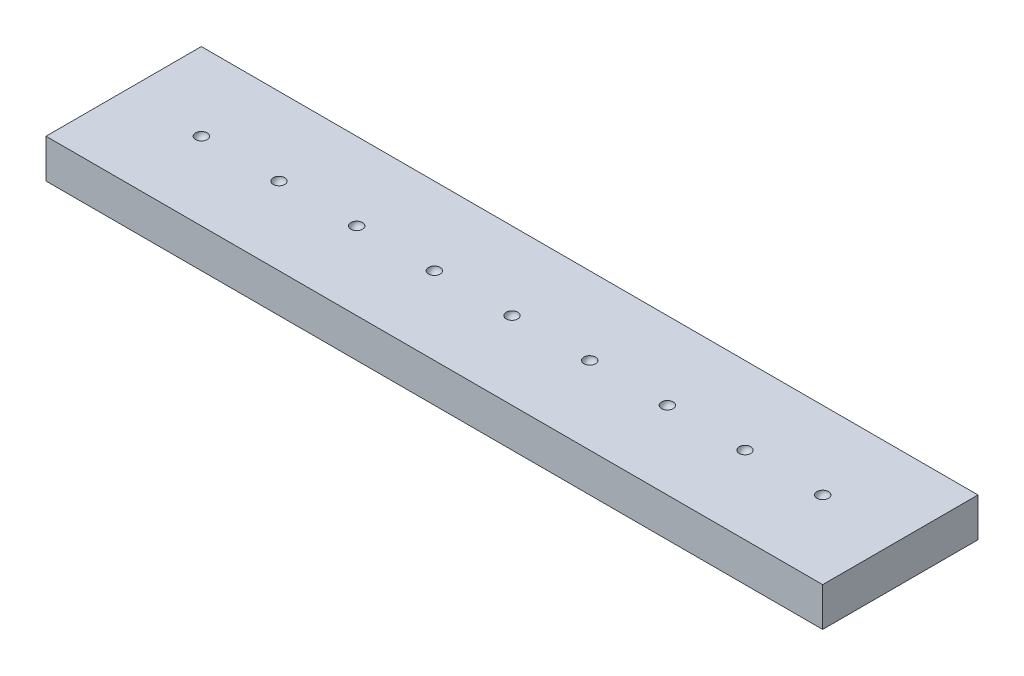
ISO-10303-21;
HEADER;
FILE_DESCRIPTION(('STEP AP214'),'2;1');
FILE_NAME('part.step','',(''),(''),'','','');
FILE_SCHEMA(('AUTOMOTIVE_DESIGN { 1 0 10303 214 1 1 1 1 }'));
ENDSEC;
DATA;
#1=APPLICATION_CONTEXT('core data for automotive mechanical design processes');
#2=APPLICATION_PROTOCOL_DEFINITION('international standard','automotive_design',2000,#1);
#3=PRODUCT_CONTEXT('',#1,'mechanical');
#4=PRODUCT('Part','Part','',(#3));
#5=PRODUCT_RELATED_PRODUCT_CATEGORY('part','',(#4));
#6=PRODUCT_DEFINITION_FORMATION('','',#4);
#7=PRODUCT_DEFINITION_CONTEXT('part definition',#1,'design');
#8=PRODUCT_DEFINITION('design','',#6,#7);
#9=PRODUCT_DEFINITION_SHAPE('','',#8);
#10=(LENGTH_UNIT() NAMED_UNIT(*) SI_UNIT(.MILLI.,.METRE.));
#11=(NAMED_UNIT(*) PLANE_ANGLE_UNIT() SI_UNIT($,.RADIAN.));
#12=(NAMED_UNIT(*) SI_UNIT($,.STERADIAN.) SOLID_ANGLE_UNIT());
#13=UNCERTAINTY_MEASURE_WITH_UNIT(LENGTH_MEASURE(1.E-05),#10,'distance_accuracy_value','');
#14=(GEOMETRIC_REPRESENTATION_CONTEXT(3) GLOBAL_UNCERTAINTY_ASSIGNED_CONTEXT((#13)) GLOBAL_UNIT_ASSIGNED_CONTEXT((#10,
#11,#12)) REPRESENTATION_CONTEXT('',''));
#15=CARTESIAN_POINT('',(0.,0.,0.));
#16=DIRECTION('',(0.,0.,1.));
#17=DIRECTION('',(1.,0.,0.));
#18=AXIS2_PLACEMENT_3D('',#15,#16,#17);
#19=CARTESIAN_POINT('',(0.,5.,0.));
#20=DIRECTION('',(1.,0.,0.));
#21=DIRECTION('',(0.,0.,-1.));
#22=AXIS2_PLACEMENT_3D('',#19,#20,#21);
#23=PLANE('',#22);
#24=DIRECTION('',(0.,0.,1.));
#25=VECTOR('',#24,1.);
#26=CARTESIAN_POINT('',(0.,0.,0.));
#27=LINE('',#26,#25);
#28=CARTESIAN_POINT('',(0.,0.,-20.));
#29=VERTEX_POINT('',#28);
#30=CARTESIAN_POINT('',(0.,0.,0.));
#31=VERTEX_POINT('',#30);
#32=EDGE_CURVE('E116',#29,#31,#27,.T.);
#33=ORIENTED_EDGE('',*,*,#32,.T.);
#34=DIRECTION('',(0.,-1.,0.));
#35=VECTOR('',#34,1.);
#36=CARTESIAN_POINT('',(0.,5.,0.));
#37=LINE('',#36,#35);
#38=CARTESIAN_POINT('',(0.,5.,0.));
#39=VERTEX_POINT('',#38);
#40=EDGE_CURVE('E11',#39,#31,#37,.T.);
#41=ORIENTED_EDGE('',*,*,#40,.F.);
#42=DIRECTION('',(0.,0.,1.));
#43=VECTOR('',#42,1.);
#44=CARTESIAN_POINT('',(0.,5.,0.));
#45=LINE('',#44,#43);
#46=CARTESIAN_POINT('',(0.,5.,-20.));
#47=VERTEX_POINT('',#46);
#48=EDGE_CURVE('E97',#47,#39,#45,.T.);
#49=ORIENTED_EDGE('',*,*,#48,.F.);
#50=DIRECTION('',(0.,-1.,0.));
#51=VECTOR('',#50,1.);
#52=CARTESIAN_POINT('',(0.,5.,-20.));
#53=LINE('',#52,#51);
#54=EDGE_CURVE('E115',#47,#29,#53,.T.);
#55=ORIENTED_EDGE('',*,*,#54,.T.);
#56=EDGE_LOOP('',(#33,#41,#49,#55));
#57=FACE_BOUND('',#56,.T.);
#58=ADVANCED_FACE('F44',(#57),#23,.F.);
#59=CARTESIAN_POINT('',(0.,5.,0.));
#60=DIRECTION('',(0.,0.,-1.));
#61=DIRECTION('',(-1.,0.,0.));
#62=AXIS2_PLACEMENT_3D('',#59,#60,#61);
#63=PLANE('',#62);
#64=DIRECTION('',(1.,0.,0.));
#65=VECTOR('',#64,1.);
#66=CARTESIAN_POINT('',(0.,0.,0.));
#67=LINE('',#66,#65);
#68=CARTESIAN_POINT('',(100.,0.,0.));
#69=VERTEX_POINT('',#68);
#70=EDGE_CURVE('E102',#31,#69,#67,.T.);
#71=ORIENTED_EDGE('',*,*,#70,.T.);
#72=DIRECTION('',(0.,-1.,0.));
#73=VECTOR('',#72,1.);
#74=CARTESIAN_POINT('',(100.,5.,0.));
#75=LINE('',#74,#73);
#76=CARTESIAN_POINT('',(100.,5.,0.));
#77=VERTEX_POINT('',#76);
#78=EDGE_CURVE('E54',#77,#69,#75,.T.);
#79=ORIENTED_EDGE('',*,*,#78,.F.);
#80=DIRECTION('',(1.,0.,0.));
#81=VECTOR('',#80,1.);
#82=CARTESIAN_POINT('',(0.,5.,0.));
#83=LINE('',#82,#81);
#84=EDGE_CURVE('E94',#39,#77,#83,.T.);
#85=ORIENTED_EDGE('',*,*,#84,.F.);
#86=ORIENTED_EDGE('',*,*,#40,.T.);
#87=EDGE_LOOP('',(#71,#79,#85,#86));
#88=FACE_BOUND('',#87,.T.);
#89=ADVANCED_FACE('F103',(#88),#63,.F.);
#90=CARTESIAN_POINT('',(100.,5.,0.));
#91=DIRECTION('',(-1.,0.,0.));
#92=DIRECTION('',(0.,0.,1.));
#93=AXIS2_PLACEMENT_3D('',#90,#91,#92);
#94=PLANE('',#93);
#95=DIRECTION('',(0.,0.,-1.));
#96=VECTOR('',#95,1.);
#97=CARTESIAN_POINT('',(100.,0.,0.));
#98=LINE('',#97,#96);
#99=CARTESIAN_POINT('',(100.,0.,-20.));
#100=VERTEX_POINT('',#99);
#101=EDGE_CURVE('E82',#69,#100,#98,.T.);
#102=ORIENTED_EDGE('',*,*,#101,.T.);
#103=DIRECTION('',(0.,-1.,0.));
#104=VECTOR('',#103,1.);
#105=CARTESIAN_POINT('',(100.,5.,-20.));
#106=LINE('',#105,#104);
#107=CARTESIAN_POINT('',(100.,5.,-20.));
#108=VERTEX_POINT('',#107);
#109=EDGE_CURVE('E106',#108,#100,#106,.T.);
#110=ORIENTED_EDGE('',*,*,#109,.F.);
#111=DIRECTION('',(0.,0.,-1.));
#112=VECTOR('',#111,1.);
#113=CARTESIAN_POINT('',(100.,5.,0.));
#114=LINE('',#113,#112);
#115=EDGE_CURVE('E100',#77,#108,#114,.T.);
#116=ORIENTED_EDGE('',*,*,#115,.F.);
#117=ORIENTED_EDGE('',*,*,#78,.T.);
#118=EDGE_LOOP('',(#102,#110,#116,#117));
#119=FACE_BOUND('',#118,.T.);
#120=ADVANCED_FACE('F107',(#119),#94,.F.);
#121=CARTESIAN_POINT('',(0.,5.,-20.));
#122=DIRECTION('',(0.,0.,1.));
#123=DIRECTION('',(1.,0.,0.));
#124=AXIS2_PLACEMENT_3D('',#121,#122,#123);
#125=PLANE('',#124);
#126=DIRECTION('',(-1.,0.,0.));
#127=VECTOR('',#126,1.);
#128=CARTESIAN_POINT('',(0.,0.,-20.));
#129=LINE('',#128,#127);
#130=EDGE_CURVE('E87',#100,#29,#129,.T.);
#131=ORIENTED_EDGE('',*,*,#130,.T.);
#132=ORIENTED_EDGE('',*,*,#54,.F.);
#133=DIRECTION('',(-1.,0.,0.));
#134=VECTOR('',#133,1.);
#135=CARTESIAN_POINT('',(0.,5.,-20.));
#136=LINE('',#135,#134);
#137=EDGE_CURVE('E63',#108,#47,#136,.T.);
#138=ORIENTED_EDGE('',*,*,#137,.F.);
#139=ORIENTED_EDGE('',*,*,#109,.T.);
#140=EDGE_LOOP('',(#131,#132,#138,#139));
#141=FACE_BOUND('',#140,.T.);
#142=ADVANCED_FACE('F198',(#141),#125,.F.);
#143=CARTESIAN_POINT('',(0.,5.,0.));
#144=DIRECTION('',(0.,-1.,0.));
#145=DIRECTION('',(0.,0.,-1.));
#146=AXIS2_PLACEMENT_3D('',#143,#144,#145);
#147=PLANE('',#146);
#148=CARTESIAN_POINT('',(10.,5.,-10.));
#149=DIRECTION('',(0.,-1.,0.));
#150=DIRECTION('',(0.,0.,-1.));
#151=AXIS2_PLACEMENT_3D('',#148,#149,#150);
#152=CIRCLE('',#151,0.750000000000002);
#153=CARTESIAN_POINT('',(10.,5.,-10.75));
#154=VERTEX_POINT('',#153);
#155=EDGE_CURVE('E48',#154,#154,#152,.T.);
#156=ORIENTED_EDGE('',*,*,#155,.T.);
#157=EDGE_LOOP('',(#156));
#158=FACE_BOUND('',#157,.T.);
#159=CARTESIAN_POINT('',(20.,5.,-10.));
#160=DIRECTION('',(0.,-1.,0.));
#161=DIRECTION('',(0.,0.,-1.));
#162=AXIS2_PLACEMENT_3D('',#159,#160,#161);
#163=CIRCLE('',#162,0.750000000000002);
#164=CARTESIAN_POINT('',(20.,5.,-10.75));
#165=VERTEX_POINT('',#164);
#166=EDGE_CURVE('E160',#165,#165,#163,.T.);
#167=ORIENTED_EDGE('',*,*,#166,.T.);
#168=EDGE_LOOP('',(#167));
#169=FACE_BOUND('',#168,.T.);
#170=CARTESIAN_POINT('',(30.,5.,-10.));
#171=DIRECTION('',(0.,-1.,0.));
#172=DIRECTION('',(0.,0.,-1.));
#173=AXIS2_PLACEMENT_3D('',#170,#171,#172);
#174=CIRCLE('',#173,0.750000000000002);
#175=CARTESIAN_POINT('',(30.,5.,-10.75));
#176=VERTEX_POINT('',#175);
#177=EDGE_CURVE('E152',#176,#176,#174,.T.);
#178=ORIENTED_EDGE('',*,*,#177,.T.);
#179=EDGE_LOOP('',(#178));
#180=FACE_BOUND('',#179,.T.);
#181=CARTESIAN_POINT('',(40.,5.,-10.));
#182=DIRECTION('',(0.,-1.,0.));
#183=DIRECTION('',(0.,0.,-1.));
#184=AXIS2_PLACEMENT_3D('',#181,#182,#183);
#185=CIRCLE('',#184,0.750000000000001);
#186=CARTESIAN_POINT('',(40.,5.,-10.75));
#187=VERTEX_POINT('',#186);
#188=EDGE_CURVE('E147',#187,#187,#185,.T.);
#189=ORIENTED_EDGE('',*,*,#188,.T.);
#190=EDGE_LOOP('',(#189));
#191=FACE_BOUND('',#190,.T.);
#192=CARTESIAN_POINT('',(50.,5.,-10.));
#193=DIRECTION('',(0.,-1.,0.));
#194=DIRECTION('',(0.,0.,-1.));
#195=AXIS2_PLACEMENT_3D('',#192,#193,#194);
#196=CIRCLE('',#195,0.750000000000001);
#197=CARTESIAN_POINT('',(50.,5.,-10.75));
#198=VERTEX_POINT('',#197);
#199=EDGE_CURVE('E148',#198,#198,#196,.T.);
#200=ORIENTED_EDGE('',*,*,#199,.T.);
#201=EDGE_LOOP('',(#200));
#202=FACE_BOUND('',#201,.T.);
#203=CARTESIAN_POINT('',(60.,5.,-10.));
#204=DIRECTION('',(0.,-1.,0.));
#205=DIRECTION('',(0.,0.,-1.));
#206=AXIS2_PLACEMENT_3D('',#203,#204,#205);
#207=CIRCLE('',#206,0.750000000000001);
#208=CARTESIAN_POINT('',(60.,5.,-10.75));
#209=VERTEX_POINT('',#208);
#210=EDGE_CURVE('E142',#209,#209,#207,.T.);
#211=ORIENTED_EDGE('',*,*,#210,.T.);
#212=EDGE_LOOP('',(#211));
#213=FACE_BOUND('',#212,.T.);
#214=CARTESIAN_POINT('',(70.,5.,-10.));
#215=DIRECTION('',(0.,-1.,0.));
#216=DIRECTION('',(0.,0.,-1.));
#217=AXIS2_PLACEMENT_3D('',#214,#215,#216);
#218=CIRCLE('',#217,0.750000000000008);
#219=CARTESIAN_POINT('',(70.,5.,-10.75));
#220=VERTEX_POINT('',#219);
#221=EDGE_CURVE('E140',#220,#220,#218,.T.);
#222=ORIENTED_EDGE('',*,*,#221,.T.);
#223=EDGE_LOOP('',(#222));
#224=FACE_BOUND('',#223,.T.);
#225=CARTESIAN_POINT('',(80.,5.,-10.));
#226=DIRECTION('',(0.,-1.,0.));
#227=DIRECTION('',(0.,0.,-1.));
#228=AXIS2_PLACEMENT_3D('',#225,#226,#227);
#229=CIRCLE('',#228,0.750000000000008);
#230=CARTESIAN_POINT('',(80.,5.,-10.75));
#231=VERTEX_POINT('',#230);
#232=EDGE_CURVE('E133',#231,#231,#229,.T.);
#233=ORIENTED_EDGE('',*,*,#232,.T.);
#234=EDGE_LOOP('',(#233));
#235=FACE_BOUND('',#234,.T.);
#236=CARTESIAN_POINT('',(90.,5.,-10.));
#237=DIRECTION('',(0.,-1.,0.));
#238=DIRECTION('',(0.,0.,-1.));
#239=AXIS2_PLACEMENT_3D('',#236,#237,#238);
#240=CIRCLE('',#239,0.750000000000001);
#241=CARTESIAN_POINT('',(90.,5.,-10.75));
#242=VERTEX_POINT('',#241);
#243=EDGE_CURVE('E128',#242,#242,#240,.T.);
#244=ORIENTED_EDGE('',*,*,#243,.T.);
#245=EDGE_LOOP('',(#244));
#246=FACE_BOUND('',#245,.T.);
#247=ORIENTED_EDGE('',*,*,#48,.T.);
#248=ORIENTED_EDGE('',*,*,#84,.T.);
#249=ORIENTED_EDGE('',*,*,#115,.T.);
#250=ORIENTED_EDGE('',*,*,#137,.T.);
#251=EDGE_LOOP('',(#247,#248,#249,#250));
#252=FACE_BOUND('',#251,.T.);
#253=ADVANCED_FACE('F92',(#158,#169,#180,#191,#202,#213,#224,#235,#246,#252),#147,.F.);
#254=CARTESIAN_POINT('',(0.,0.,0.));
#255=DIRECTION('',(0.,-1.,0.));
#256=DIRECTION('',(0.,0.,-1.));
#257=AXIS2_PLACEMENT_3D('',#254,#255,#256);
#258=PLANE('',#257);
#259=ORIENTED_EDGE('',*,*,#32,.F.);
#260=ORIENTED_EDGE('',*,*,#130,.F.);
#261=ORIENTED_EDGE('',*,*,#101,.F.);
#262=ORIENTED_EDGE('',*,*,#70,.F.);
#263=EDGE_LOOP('',(#259,#260,#261,#262));
#264=FACE_BOUND('',#263,.T.);
#265=ADVANCED_FACE('F184',(#264),#258,.T.);
#266=CARTESIAN_POINT('',(90.,5.,-10.));
#267=DIRECTION('',(-1.,0.,0.));
#268=DIRECTION('',(0.,0.,1.));
#269=AXIS2_PLACEMENT_3D('',#266,#267,#268);
#270=SPHERICAL_SURFACE('',#269,0.750000000000001);
#271=CARTESIAN_POINT('',(90.,5.,-10.));
#272=DIRECTION('',(0.,-1.,0.));
#273=DIRECTION('',(0.,0.,-1.));
#274=AXIS2_PLACEMENT_3D('',#271,#272,#273);
#275=SPHERICAL_SURFACE('',#274,0.750000000000001);
#276=ORIENTED_EDGE('',*,*,#243,.F.);
#277=EDGE_LOOP('',(#276));
#278=FACE_BOUND('',#277,.T.);
#279=ADVANCED_FACE('F186',(#278),#275,.F.);
#280=CARTESIAN_POINT('',(80.,5.,-10.));
#281=DIRECTION('',(-1.,0.,0.));
#282=DIRECTION('',(0.,0.,1.));
#283=AXIS2_PLACEMENT_3D('',#280,#281,#282);
#284=SPHERICAL_SURFACE('',#283,0.750000000000008);
#285=CARTESIAN_POINT('',(80.,5.,-10.));
#286=DIRECTION('',(0.,-1.,0.));
#287=DIRECTION('',(0.,0.,-1.));
#288=AXIS2_PLACEMENT_3D('',#285,#286,#287);
#289=SPHERICAL_SURFACE('',#288,0.750000000000008);
#290=ORIENTED_EDGE('',*,*,#232,.F.);
#291=EDGE_LOOP('',(#290));
#292=FACE_BOUND('',#291,.T.);
#293=ADVANCED_FACE('F195',(#292),#289,.F.);
#294=CARTESIAN_POINT('',(70.,5.,-10.));
#295=DIRECTION('',(-1.,0.,0.));
#296=DIRECTION('',(0.,0.,1.));
#297=AXIS2_PLACEMENT_3D('',#294,#295,#296);
#298=SPHERICAL_SURFACE('',#297,0.750000000000008);
#299=CARTESIAN_POINT('',(70.,5.,-10.));
#300=DIRECTION('',(0.,-1.,0.));
#301=DIRECTION('',(0.,0.,-1.));
#302=AXIS2_PLACEMENT_3D('',#299,#300,#301);
#303=SPHERICAL_SURFACE('',#302,0.750000000000008);
#304=ORIENTED_EDGE('',*,*,#221,.F.);
#305=EDGE_LOOP('',(#304));
#306=FACE_BOUND('',#305,.T.);
#307=ADVANCED_FACE('F237',(#306),#303,.F.);
#308=CARTESIAN_POINT('',(60.,5.,-10.));
#309=DIRECTION('',(-1.,0.,0.));
#310=DIRECTION('',(0.,0.,1.));
#311=AXIS2_PLACEMENT_3D('',#308,#309,#310);
#312=SPHERICAL_SURFACE('',#311,0.750000000000001);
#313=CARTESIAN_POINT('',(60.,5.,-10.));
#314=DIRECTION('',(0.,-1.,0.));
#315=DIRECTION('',(0.,0.,-1.));
#316=AXIS2_PLACEMENT_3D('',#313,#314,#315);
#317=SPHERICAL_SURFACE('',#316,0.750000000000001);
#318=ORIENTED_EDGE('',*,*,#210,.F.);
#319=EDGE_LOOP('',(#318));
#320=FACE_BOUND('',#319,.T.);
#321=ADVANCED_FACE('F247',(#320),#317,.F.);
#322=CARTESIAN_POINT('',(50.,5.,-10.));
#323=DIRECTION('',(-1.,0.,0.));
#324=DIRECTION('',(0.,0.,1.));
#325=AXIS2_PLACEMENT_3D('',#322,#323,#324);
#326=SPHERICAL_SURFACE('',#325,0.750000000000001);
#327=CARTESIAN_POINT('',(50.,5.,-10.));
#328=DIRECTION('',(0.,-1.,0.));
#329=DIRECTION('',(0.,0.,-1.));
#330=AXIS2_PLACEMENT_3D('',#327,#328,#329);
#331=SPHERICAL_SURFACE('',#330,0.750000000000001);
#332=ORIENTED_EDGE('',*,*,#199,.F.);
#333=EDGE_LOOP('',(#332));
#334=FACE_BOUND('',#333,.T.);
#335=ADVANCED_FACE('F258',(#334),#331,.F.);
#336=CARTESIAN_POINT('',(40.,5.,-10.));
#337=DIRECTION('',(-1.,0.,0.));
#338=DIRECTION('',(0.,0.,1.));
#339=AXIS2_PLACEMENT_3D('',#336,#337,#338);
#340=SPHERICAL_SURFACE('',#339,0.750000000000001);
#341=CARTESIAN_POINT('',(40.,5.,-10.));
#342=DIRECTION('',(0.,-1.,0.));
#343=DIRECTION('',(0.,0.,-1.));
#344=AXIS2_PLACEMENT_3D('',#341,#342,#343);
#345=SPHERICAL_SURFACE('',#344,0.750000000000001);
#346=ORIENTED_EDGE('',*,*,#188,.F.);
#347=EDGE_LOOP('',(#346));
#348=FACE_BOUND('',#347,.T.);
#349=ADVANCED_FACE('F266',(#348),#345,.F.);
#350=CARTESIAN_POINT('',(30.,5.,-10.));
#351=DIRECTION('',(-1.,0.,0.));
#352=DIRECTION('',(0.,0.,1.));
#353=AXIS2_PLACEMENT_3D('',#350,#351,#352);
#354=SPHERICAL_SURFACE('',#353,0.750000000000002);
#355=CARTESIAN_POINT('',(30.,5.,-10.));
#356=DIRECTION('',(0.,-1.,0.));
#357=DIRECTION('',(0.,0.,-1.));
#358=AXIS2_PLACEMENT_3D('',#355,#356,#357);
#359=SPHERICAL_SURFACE('',#358,0.750000000000002);
#360=ORIENTED_EDGE('',*,*,#177,.F.);
#361=EDGE_LOOP('',(#360));
#362=FACE_BOUND('',#361,.T.);
#363=ADVANCED_FACE('F173',(#362),#359,.F.);
#364=CARTESIAN_POINT('',(20.,5.,-10.));
#365=DIRECTION('',(-1.,0.,0.));
#366=DIRECTION('',(0.,0.,1.));
#367=AXIS2_PLACEMENT_3D('',#364,#365,#366);
#368=SPHERICAL_SURFACE('',#367,0.750000000000002);
#369=CARTESIAN_POINT('',(20.,5.,-10.));
#370=DIRECTION('',(0.,-1.,0.));
#371=DIRECTION('',(0.,0.,-1.));
#372=AXIS2_PLACEMENT_3D('',#369,#370,#371);
#373=SPHERICAL_SURFACE('',#372,0.750000000000002);
#374=ORIENTED_EDGE('',*,*,#166,.F.);
#375=EDGE_LOOP('',(#374));
#376=FACE_BOUND('',#375,.T.);
#377=ADVANCED_FACE('F166',(#376),#373,.F.);
#378=CARTESIAN_POINT('',(10.,5.,-10.));
#379=DIRECTION('',(-1.,0.,0.));
#380=DIRECTION('',(0.,0.,1.));
#381=AXIS2_PLACEMENT_3D('',#378,#379,#380);
#382=SPHERICAL_SURFACE('',#381,0.750000000000002);
#383=CARTESIAN_POINT('',(10.,5.,-10.));
#384=DIRECTION('',(0.,-1.,0.));
#385=DIRECTION('',(0.,0.,-1.));
#386=AXIS2_PLACEMENT_3D('',#383,#384,#385);
#387=SPHERICAL_SURFACE('',#386,0.750000000000002);
#388=ORIENTED_EDGE('',*,*,#155,.F.);
#389=EDGE_LOOP('',(#388));
#390=FACE_BOUND('',#389,.T.);
#391=ADVANCED_FACE('F170',(#390),#387,.F.);
#392=CLOSED_SHELL('',(#58,#89,#120,#142,#253,#265,#279,#293,#307,#321,#335,#349,#363,#377,#391));
#393=MANIFOLD_SOLID_BREP('B2',#392);
#394=ADVANCED_BREP_SHAPE_REPRESENTATION('',(#18,#393),#14);
#395=SHAPE_DEFINITION_REPRESENTATION(#9,#394);
ENDSEC;
END-ISO-10303-21;
